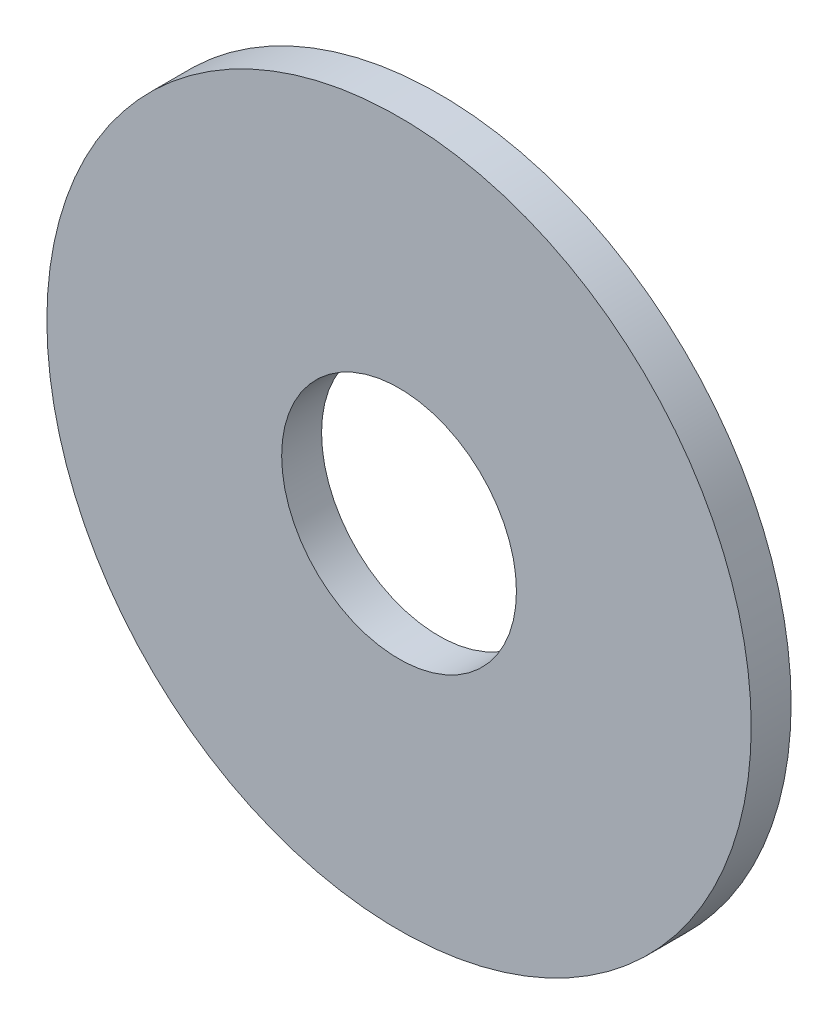
ISO-10303-21;
HEADER;
FILE_DESCRIPTION(('STEP AP214'),'2;1');
FILE_NAME('part.step','',(''),(''),'','','');
FILE_SCHEMA(('AUTOMOTIVE_DESIGN { 1 0 10303 214 1 1 1 1 }'));
ENDSEC;
DATA;
#1=APPLICATION_CONTEXT('core data for automotive mechanical design processes');
#2=APPLICATION_PROTOCOL_DEFINITION('international standard','automotive_design',2000,#1);
#3=PRODUCT_CONTEXT('',#1,'mechanical');
#4=PRODUCT('Part','Part','',(#3));
#5=PRODUCT_RELATED_PRODUCT_CATEGORY('part','',(#4));
#6=PRODUCT_DEFINITION_FORMATION('','',#4);
#7=PRODUCT_DEFINITION_CONTEXT('part definition',#1,'design');
#8=PRODUCT_DEFINITION('design','',#6,#7);
#9=PRODUCT_DEFINITION_SHAPE('','',#8);
#10=(LENGTH_UNIT() NAMED_UNIT(*) SI_UNIT(.MILLI.,.METRE.));
#11=(NAMED_UNIT(*) PLANE_ANGLE_UNIT() SI_UNIT($,.RADIAN.));
#12=(NAMED_UNIT(*) SI_UNIT($,.STERADIAN.) SOLID_ANGLE_UNIT());
#13=UNCERTAINTY_MEASURE_WITH_UNIT(LENGTH_MEASURE(1.E-05),#10,'distance_accuracy_value','');
#14=(GEOMETRIC_REPRESENTATION_CONTEXT(3) GLOBAL_UNCERTAINTY_ASSIGNED_CONTEXT((#13)) GLOBAL_UNIT_ASSIGNED_CONTEXT((#10,
#11,#12)) REPRESENTATION_CONTEXT('',''));
#15=CARTESIAN_POINT('',(0.,0.,0.));
#16=DIRECTION('',(0.,0.,1.));
#17=DIRECTION('',(1.,0.,0.));
#18=AXIS2_PLACEMENT_3D('',#15,#16,#17);
#19=CARTESIAN_POINT('',(0.,0.,1.7));
#20=DIRECTION('',(0.,0.,1.));
#21=DIRECTION('',(1.,0.,0.));
#22=AXIS2_PLACEMENT_3D('',#19,#20,#21);
#23=PLANE('',#22);
#24=CARTESIAN_POINT('',(0.,0.,1.7));
#25=DIRECTION('',(0.,0.,1.));
#26=DIRECTION('',(1.,0.,0.));
#27=AXIS2_PLACEMENT_3D('',#24,#25,#26);
#28=CIRCLE('',#27,15.);
#29=CARTESIAN_POINT('',(15.,0.,1.7));
#30=VERTEX_POINT('',#29);
#31=EDGE_CURVE('E10',#30,#30,#28,.T.);
#32=ORIENTED_EDGE('',*,*,#31,.T.);
#33=EDGE_LOOP('',(#32));
#34=FACE_BOUND('',#33,.T.);
#35=CARTESIAN_POINT('',(0.,0.,1.7));
#36=DIRECTION('',(0.,0.,1.));
#37=DIRECTION('',(1.,0.,0.));
#38=AXIS2_PLACEMENT_3D('',#35,#36,#37);
#39=CIRCLE('',#38,5.);
#40=CARTESIAN_POINT('',(5.,0.,1.7));
#41=VERTEX_POINT('',#40);
#42=EDGE_CURVE('E41',#41,#41,#39,.T.);
#43=ORIENTED_EDGE('',*,*,#42,.F.);
#44=EDGE_LOOP('',(#43));
#45=FACE_BOUND('',#44,.T.);
#46=ADVANCED_FACE('F30',(#34,#45),#23,.T.);
#47=CARTESIAN_POINT('',(0.,0.,0.));
#48=DIRECTION('',(0.,0.,1.));
#49=DIRECTION('',(1.,0.,0.));
#50=AXIS2_PLACEMENT_3D('',#47,#48,#49);
#51=PLANE('',#50);
#52=CARTESIAN_POINT('',(0.,0.,0.));
#53=DIRECTION('',(0.,0.,1.));
#54=DIRECTION('',(1.,0.,0.));
#55=AXIS2_PLACEMENT_3D('',#52,#53,#54);
#56=CIRCLE('',#55,15.);
#57=CARTESIAN_POINT('',(15.,0.,0.));
#58=VERTEX_POINT('',#57);
#59=EDGE_CURVE('E34',#58,#58,#56,.T.);
#60=ORIENTED_EDGE('',*,*,#59,.F.);
#61=EDGE_LOOP('',(#60));
#62=FACE_BOUND('',#61,.T.);
#63=CARTESIAN_POINT('',(0.,0.,0.));
#64=DIRECTION('',(0.,0.,1.));
#65=DIRECTION('',(1.,0.,0.));
#66=AXIS2_PLACEMENT_3D('',#63,#64,#65);
#67=CIRCLE('',#66,5.);
#68=CARTESIAN_POINT('',(5.,0.,0.));
#69=VERTEX_POINT('',#68);
#70=EDGE_CURVE('E43',#69,#69,#67,.T.);
#71=ORIENTED_EDGE('',*,*,#70,.T.);
#72=EDGE_LOOP('',(#71));
#73=FACE_BOUND('',#72,.T.);
#74=ADVANCED_FACE('F53',(#62,#73),#51,.F.);
#75=CARTESIAN_POINT('',(0.,0.,1.7));
#76=DIRECTION('',(0.,0.,-1.));
#77=DIRECTION('',(-1.,0.,0.));
#78=AXIS2_PLACEMENT_3D('',#75,#76,#77);
#79=CYLINDRICAL_SURFACE('',#78,15.);
#80=ORIENTED_EDGE('',*,*,#31,.F.);
#81=EDGE_LOOP('',(#80));
#82=FACE_BOUND('',#81,.T.);
#83=ORIENTED_EDGE('',*,*,#59,.T.);
#84=EDGE_LOOP('',(#83));
#85=FACE_BOUND('',#84,.T.);
#86=ADVANCED_FACE('F32',(#82,#85),#79,.T.);
#87=CARTESIAN_POINT('',(0.,0.,1.7));
#88=DIRECTION('',(0.,0.,-1.));
#89=DIRECTION('',(-1.,0.,0.));
#90=AXIS2_PLACEMENT_3D('',#87,#88,#89);
#91=CYLINDRICAL_SURFACE('',#90,5.);
#92=ORIENTED_EDGE('',*,*,#42,.T.);
#93=EDGE_LOOP('',(#92));
#94=FACE_BOUND('',#93,.T.);
#95=ORIENTED_EDGE('',*,*,#70,.F.);
#96=EDGE_LOOP('',(#95));
#97=FACE_BOUND('',#96,.T.);
#98=ADVANCED_FACE('F49',(#94,#97),#91,.F.);
#99=CLOSED_SHELL('',(#46,#74,#86,#98));
#100=MANIFOLD_SOLID_BREP('B2',#99);
#101=ADVANCED_BREP_SHAPE_REPRESENTATION('',(#18,#100),#14);
#102=SHAPE_DEFINITION_REPRESENTATION(#9,#101);
ENDSEC;
END-ISO-10303-21;
